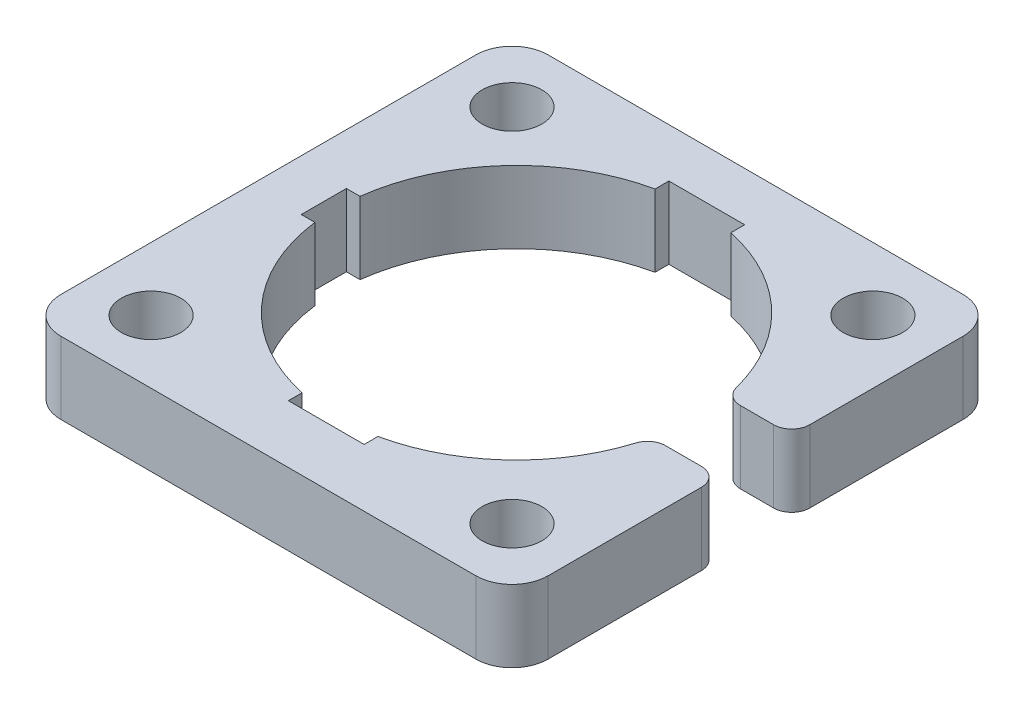
ISO-10303-21;
HEADER;
FILE_DESCRIPTION(('STEP AP214'),'2;1');
FILE_NAME('part.step','',(''),(''),'','','');
FILE_SCHEMA(('AUTOMOTIVE_DESIGN { 1 0 10303 214 1 1 1 1 }'));
ENDSEC;
DATA;
#1=APPLICATION_CONTEXT('core data for automotive mechanical design processes');
#2=APPLICATION_PROTOCOL_DEFINITION('international standard','automotive_design',2000,#1);
#3=PRODUCT_CONTEXT('',#1,'mechanical');
#4=PRODUCT('Part','Part','',(#3));
#5=PRODUCT_RELATED_PRODUCT_CATEGORY('part','',(#4));
#6=PRODUCT_DEFINITION_FORMATION('','',#4);
#7=PRODUCT_DEFINITION_CONTEXT('part definition',#1,'design');
#8=PRODUCT_DEFINITION('design','',#6,#7);
#9=PRODUCT_DEFINITION_SHAPE('','',#8);
#10=(LENGTH_UNIT() NAMED_UNIT(*) SI_UNIT(.MILLI.,.METRE.));
#11=(NAMED_UNIT(*) PLANE_ANGLE_UNIT() SI_UNIT($,.RADIAN.));
#12=(NAMED_UNIT(*) SI_UNIT($,.STERADIAN.) SOLID_ANGLE_UNIT());
#13=UNCERTAINTY_MEASURE_WITH_UNIT(LENGTH_MEASURE(1.E-05),#10,'distance_accuracy_value','');
#14=(GEOMETRIC_REPRESENTATION_CONTEXT(3) GLOBAL_UNCERTAINTY_ASSIGNED_CONTEXT((#13)) GLOBAL_UNIT_ASSIGNED_CONTEXT((#10,
#11,#12)) REPRESENTATION_CONTEXT('',''));
#15=CARTESIAN_POINT('',(0.,0.,0.));
#16=DIRECTION('',(0.,0.,1.));
#17=DIRECTION('',(1.,0.,0.));
#18=AXIS2_PLACEMENT_3D('',#15,#16,#17);
#19=CARTESIAN_POINT('',(13.5,4.,13.5));
#20=DIRECTION('',(-1.,0.,0.));
#21=DIRECTION('',(0.,0.,1.));
#22=AXIS2_PLACEMENT_3D('',#19,#20,#21);
#23=PLANE('',#22);
#24=DIRECTION('',(0.,0.,-1.));
#25=VECTOR('',#24,1.);
#26=CARTESIAN_POINT('',(13.5,0.,13.5));
#27=LINE('',#26,#25);
#28=CARTESIAN_POINT('',(13.5,0.,11.5));
#29=VERTEX_POINT('',#28);
#30=CARTESIAN_POINT('',(13.5,0.,3.));
#31=VERTEX_POINT('',#30);
#32=EDGE_CURVE('E379',#29,#31,#27,.T.);
#33=ORIENTED_EDGE('',*,*,#32,.T.);
#34=DIRECTION('',(0.,1.,0.));
#35=VECTOR('',#34,1.);
#36=CARTESIAN_POINT('',(13.5,4.,3.));
#37=LINE('',#36,#35);
#38=CARTESIAN_POINT('',(13.5,4.,3.));
#39=VERTEX_POINT('',#38);
#40=EDGE_CURVE('E428',#31,#39,#37,.T.);
#41=ORIENTED_EDGE('',*,*,#40,.T.);
#42=DIRECTION('',(0.,0.,-1.));
#43=VECTOR('',#42,1.);
#44=CARTESIAN_POINT('',(13.5,4.,13.5));
#45=LINE('',#44,#43);
#46=CARTESIAN_POINT('',(13.5,4.,11.5));
#47=VERTEX_POINT('',#46);
#48=EDGE_CURVE('E365',#47,#39,#45,.T.);
#49=ORIENTED_EDGE('',*,*,#48,.F.);
#50=DIRECTION('',(0.,-1.,0.));
#51=VECTOR('',#50,1.);
#52=CARTESIAN_POINT('',(13.5,4.,11.5));
#53=LINE('',#52,#51);
#54=EDGE_CURVE('E404',#47,#29,#53,.T.);
#55=ORIENTED_EDGE('',*,*,#54,.T.);
#56=EDGE_LOOP('',(#33,#41,#49,#55));
#57=FACE_BOUND('',#56,.T.);
#58=ADVANCED_FACE('F37',(#57),#23,.F.);
#59=CARTESIAN_POINT('',(0.,4.,0.));
#60=DIRECTION('',(0.,-1.,0.));
#61=DIRECTION('',(0.,0.,-1.));
#62=AXIS2_PLACEMENT_3D('',#59,#60,#61);
#63=PLANE('',#62);
#64=ORIENTED_EDGE('',*,*,#48,.T.);
#65=CARTESIAN_POINT('',(12.5,4.,3.));
#66=DIRECTION('',(0.,-1.,0.));
#67=DIRECTION('',(0.,0.,-1.));
#68=AXIS2_PLACEMENT_3D('',#65,#66,#67);
#69=CIRCLE('',#68,1.);
#70=CARTESIAN_POINT('',(12.5,4.,2.));
#71=VERTEX_POINT('',#70);
#72=EDGE_CURVE('E437',#39,#71,#69,.F.);
#73=ORIENTED_EDGE('',*,*,#72,.T.);
#74=DIRECTION('',(1.,0.,0.));
#75=VECTOR('',#74,1.);
#76=CARTESIAN_POINT('',(17.9420867867306,4.,2.));
#77=LINE('',#76,#75);
#78=CARTESIAN_POINT('',(10.5089247784919,4.,2.));
#79=VERTEX_POINT('',#78);
#80=EDGE_CURVE('E256',#79,#71,#77,.T.);
#81=ORIENTED_EDGE('',*,*,#80,.F.);
#82=CARTESIAN_POINT('',(10.5089247784919,4.,3.));
#83=DIRECTION('',(0.,-1.,0.));
#84=DIRECTION('',(0.,0.,-1.));
#85=AXIS2_PLACEMENT_3D('',#82,#83,#84);
#86=CIRCLE('',#85,1.);
#87=CARTESIAN_POINT('',(9.55356798044714,4.,2.70454545454545));
#88=VERTEX_POINT('',#87);
#89=EDGE_CURVE('E435',#79,#88,#86,.F.);
#90=ORIENTED_EDGE('',*,*,#89,.T.);
#91=CARTESIAN_POINT('',(0.,4.,-0.250000000000002));
#92=DIRECTION('',(0.,1.,0.));
#93=DIRECTION('',(0.,0.,1.));
#94=AXIS2_PLACEMENT_3D('',#91,#92,#93);
#95=CIRCLE('',#94,10.);
#96=CARTESIAN_POINT('',(2.1,4.,9.52701385904714));
#97=VERTEX_POINT('',#96);
#98=EDGE_CURVE('E296',#97,#88,#95,.T.);
#99=ORIENTED_EDGE('',*,*,#98,.F.);
#100=DIRECTION('',(0.,0.,-1.));
#101=VECTOR('',#100,1.);
#102=CARTESIAN_POINT('',(2.1,4.,10.2928885984819));
#103=LINE('',#102,#101);
#104=CARTESIAN_POINT('',(2.1,4.,10.2928885984819));
#105=VERTEX_POINT('',#104);
#106=EDGE_CURVE('E293',#105,#97,#103,.T.);
#107=ORIENTED_EDGE('',*,*,#106,.F.);
#108=DIRECTION('',(1.,0.,0.));
#109=VECTOR('',#108,1.);
#110=CARTESIAN_POINT('',(-2.1,4.,10.2928885984819));
#111=LINE('',#110,#109);
#112=CARTESIAN_POINT('',(-2.1,4.,10.2928885984819));
#113=VERTEX_POINT('',#112);
#114=EDGE_CURVE('E290',#113,#105,#111,.T.);
#115=ORIENTED_EDGE('',*,*,#114,.F.);
#116=DIRECTION('',(0.,0.,1.));
#117=VECTOR('',#116,1.);
#118=CARTESIAN_POINT('',(-2.1,4.,9.52701385904714));
#119=LINE('',#118,#117);
#120=CARTESIAN_POINT('',(-2.1,4.,9.52701385904714));
#121=VERTEX_POINT('',#120);
#122=EDGE_CURVE('E287',#121,#113,#119,.T.);
#123=ORIENTED_EDGE('',*,*,#122,.F.);
#124=CARTESIAN_POINT('',(0.,4.,-0.250000000000002));
#125=DIRECTION('',(0.,1.,0.));
#126=DIRECTION('',(0.,0.,1.));
#127=AXIS2_PLACEMENT_3D('',#124,#125,#126);
#128=CIRCLE('',#127,10.);
#129=CARTESIAN_POINT('',(-9.92156741649221,4.,1.));
#130=VERTEX_POINT('',#129);
#131=EDGE_CURVE('E231',#130,#121,#128,.T.);
#132=ORIENTED_EDGE('',*,*,#131,.F.);
#133=DIRECTION('',(1.,0.,0.));
#134=VECTOR('',#133,1.);
#135=CARTESIAN_POINT('',(-10.6770782520313,4.,0.999999999999998));
#136=LINE('',#135,#134);
#137=CARTESIAN_POINT('',(-10.6770782520313,4.,0.999999999999998));
#138=VERTEX_POINT('',#137);
#139=EDGE_CURVE('E250',#138,#130,#136,.T.);
#140=ORIENTED_EDGE('',*,*,#139,.F.);
#141=DIRECTION('',(0.,0.,1.));
#142=VECTOR('',#141,1.);
#143=CARTESIAN_POINT('',(-10.6770782520313,4.,-1.5));
#144=LINE('',#143,#142);
#145=CARTESIAN_POINT('',(-10.6770782520313,4.,-1.5));
#146=VERTEX_POINT('',#145);
#147=EDGE_CURVE('E253',#146,#138,#144,.T.);
#148=ORIENTED_EDGE('',*,*,#147,.F.);
#149=DIRECTION('',(-1.,0.,0.));
#150=VECTOR('',#149,1.);
#151=CARTESIAN_POINT('',(-9.92156741649221,4.,-1.5));
#152=LINE('',#151,#150);
#153=CARTESIAN_POINT('',(-9.92156741649221,4.,-1.5));
#154=VERTEX_POINT('',#153);
#155=EDGE_CURVE('E313',#154,#146,#152,.T.);
#156=ORIENTED_EDGE('',*,*,#155,.F.);
#157=CARTESIAN_POINT('',(0.,4.,-0.250000000000002));
#158=DIRECTION('',(0.,1.,0.));
#159=DIRECTION('',(0.,0.,1.));
#160=AXIS2_PLACEMENT_3D('',#157,#158,#159);
#161=CIRCLE('',#160,10.);
#162=CARTESIAN_POINT('',(-2.1,4.,-10.0270138590471));
#163=VERTEX_POINT('',#162);
#164=EDGE_CURVE('E310',#163,#154,#161,.T.);
#165=ORIENTED_EDGE('',*,*,#164,.F.);
#166=DIRECTION('',(0.,0.,1.));
#167=VECTOR('',#166,1.);
#168=CARTESIAN_POINT('',(-2.1,4.,-10.0270138590471));
#169=LINE('',#168,#167);
#170=CARTESIAN_POINT('',(-2.1,4.,-10.7928885984819));
#171=VERTEX_POINT('',#170);
#172=EDGE_CURVE('E307',#171,#163,#169,.T.);
#173=ORIENTED_EDGE('',*,*,#172,.F.);
#174=DIRECTION('',(-1.,0.,0.));
#175=VECTOR('',#174,1.);
#176=CARTESIAN_POINT('',(-2.1,4.,-10.7928885984819));
#177=LINE('',#176,#175);
#178=CARTESIAN_POINT('',(2.1,4.,-10.7928885984819));
#179=VERTEX_POINT('',#178);
#180=EDGE_CURVE('E304',#179,#171,#177,.T.);
#181=ORIENTED_EDGE('',*,*,#180,.F.);
#182=DIRECTION('',(0.,0.,-1.));
#183=VECTOR('',#182,1.);
#184=CARTESIAN_POINT('',(2.1,4.,-10.7928885984819));
#185=LINE('',#184,#183);
#186=CARTESIAN_POINT('',(2.1,4.,-10.0270138590472));
#187=VERTEX_POINT('',#186);
#188=EDGE_CURVE('E301',#187,#179,#185,.T.);
#189=ORIENTED_EDGE('',*,*,#188,.F.);
#190=CARTESIAN_POINT('',(0.,4.,-0.250000000000002));
#191=DIRECTION('',(0.,1.,0.));
#192=DIRECTION('',(0.,0.,1.));
#193=AXIS2_PLACEMENT_3D('',#190,#191,#192);
#194=CIRCLE('',#193,10.);
#195=CARTESIAN_POINT('',(9.68245836551854,4.,-2.75));
#196=VERTEX_POINT('',#195);
#197=EDGE_CURVE('E299',#196,#187,#194,.T.);
#198=ORIENTED_EDGE('',*,*,#197,.F.);
#199=CARTESIAN_POINT('',(10.6507042020704,4.,-3.));
#200=DIRECTION('',(0.,-1.,0.));
#201=DIRECTION('',(0.,0.,-1.));
#202=AXIS2_PLACEMENT_3D('',#199,#200,#201);
#203=CIRCLE('',#202,1.);
#204=CARTESIAN_POINT('',(10.6507042020704,4.,-2.));
#205=VERTEX_POINT('',#204);
#206=EDGE_CURVE('E433',#196,#205,#203,.F.);
#207=ORIENTED_EDGE('',*,*,#206,.T.);
#208=DIRECTION('',(-1.,0.,0.));
#209=VECTOR('',#208,1.);
#210=CARTESIAN_POINT('',(17.9420867867306,4.,-2.));
#211=LINE('',#210,#209);
#212=CARTESIAN_POINT('',(12.5,4.,-2.));
#213=VERTEX_POINT('',#212);
#214=EDGE_CURVE('E463',#213,#205,#211,.T.);
#215=ORIENTED_EDGE('',*,*,#214,.F.);
#216=CARTESIAN_POINT('',(12.5,4.,-3.));
#217=DIRECTION('',(0.,-1.,0.));
#218=DIRECTION('',(0.,0.,-1.));
#219=AXIS2_PLACEMENT_3D('',#216,#217,#218);
#220=CIRCLE('',#219,1.);
#221=CARTESIAN_POINT('',(13.5,4.,-3.));
#222=VERTEX_POINT('',#221);
#223=EDGE_CURVE('E431',#213,#222,#220,.F.);
#224=ORIENTED_EDGE('',*,*,#223,.T.);
#225=CARTESIAN_POINT('',(13.5,4.,-11.5));
#226=VERTEX_POINT('',#225);
#227=EDGE_CURVE('E369',#222,#226,#45,.T.);
#228=ORIENTED_EDGE('',*,*,#227,.T.);
#229=CARTESIAN_POINT('',(11.5,4.,-11.5));
#230=DIRECTION('',(0.,-1.,0.));
#231=DIRECTION('',(0.,0.,-1.));
#232=AXIS2_PLACEMENT_3D('',#229,#230,#231);
#233=CIRCLE('',#232,2.);
#234=CARTESIAN_POINT('',(11.5,4.,-13.5));
#235=VERTEX_POINT('',#234);
#236=EDGE_CURVE('E416',#226,#235,#233,.F.);
#237=ORIENTED_EDGE('',*,*,#236,.T.);
#238=DIRECTION('',(-1.,0.,0.));
#239=VECTOR('',#238,1.);
#240=CARTESIAN_POINT('',(-13.5,4.,-13.5));
#241=LINE('',#240,#239);
#242=CARTESIAN_POINT('',(-11.5,4.,-13.5));
#243=VERTEX_POINT('',#242);
#244=EDGE_CURVE('E368',#235,#243,#241,.T.);
#245=ORIENTED_EDGE('',*,*,#244,.T.);
#246=CARTESIAN_POINT('',(-11.5,4.,-11.5));
#247=DIRECTION('',(0.,-1.,0.));
#248=DIRECTION('',(0.,0.,-1.));
#249=AXIS2_PLACEMENT_3D('',#246,#247,#248);
#250=CIRCLE('',#249,2.);
#251=CARTESIAN_POINT('',(-13.5,4.,-11.5));
#252=VERTEX_POINT('',#251);
#253=EDGE_CURVE('E410',#243,#252,#250,.F.);
#254=ORIENTED_EDGE('',*,*,#253,.T.);
#255=DIRECTION('',(0.,0.,1.));
#256=VECTOR('',#255,1.);
#257=CARTESIAN_POINT('',(-13.5,4.,13.5));
#258=LINE('',#257,#256);
#259=CARTESIAN_POINT('',(-13.5,4.,11.5));
#260=VERTEX_POINT('',#259);
#261=EDGE_CURVE('E372',#252,#260,#258,.T.);
#262=ORIENTED_EDGE('',*,*,#261,.T.);
#263=CARTESIAN_POINT('',(-11.5,4.,11.5));
#264=DIRECTION('',(0.,-1.,0.));
#265=DIRECTION('',(0.,0.,-1.));
#266=AXIS2_PLACEMENT_3D('',#263,#264,#265);
#267=CIRCLE('',#266,2.);
#268=CARTESIAN_POINT('',(-11.5,4.,13.5));
#269=VERTEX_POINT('',#268);
#270=EDGE_CURVE('E412',#260,#269,#267,.F.);
#271=ORIENTED_EDGE('',*,*,#270,.T.);
#272=DIRECTION('',(1.,0.,0.));
#273=VECTOR('',#272,1.);
#274=CARTESIAN_POINT('',(-13.5,4.,13.5));
#275=LINE('',#274,#273);
#276=CARTESIAN_POINT('',(11.5,4.,13.5));
#277=VERTEX_POINT('',#276);
#278=EDGE_CURVE('E375',#269,#277,#275,.T.);
#279=ORIENTED_EDGE('',*,*,#278,.T.);
#280=CARTESIAN_POINT('',(11.5,4.,11.5));
#281=DIRECTION('',(0.,-1.,0.));
#282=DIRECTION('',(0.,0.,-1.));
#283=AXIS2_PLACEMENT_3D('',#280,#281,#282);
#284=CIRCLE('',#283,2.);
#285=EDGE_CURVE('E414',#277,#47,#284,.F.);
#286=ORIENTED_EDGE('',*,*,#285,.T.);
#287=EDGE_LOOP('',(#64,#73,#81,#90,#99,#107,#115,#123,#132,#140,#148,#156,#165,#173,#181,#189,
#198,#207,#215,#224,#228,#237,#245,#254,#262,#271,#279,#286));
#288=FACE_BOUND('',#287,.T.);
#289=CARTESIAN_POINT('',(10.,4.,-10.));
#290=DIRECTION('',(0.,1.,0.));
#291=DIRECTION('',(0.,0.,1.));
#292=AXIS2_PLACEMENT_3D('',#289,#290,#291);
#293=CIRCLE('',#292,1.64999999999999);
#294=CARTESIAN_POINT('',(10.,4.,-8.35000000000001));
#295=VERTEX_POINT('',#294);
#296=EDGE_CURVE('E359',#295,#295,#293,.T.);
#297=ORIENTED_EDGE('',*,*,#296,.F.);
#298=EDGE_LOOP('',(#297));
#299=FACE_BOUND('',#298,.T.);
#300=CARTESIAN_POINT('',(10.,4.,10.));
#301=DIRECTION('',(0.,1.,0.));
#302=DIRECTION('',(0.,0.,1.));
#303=AXIS2_PLACEMENT_3D('',#300,#301,#302);
#304=CIRCLE('',#303,1.64999999999999);
#305=CARTESIAN_POINT('',(10.,4.,11.65));
#306=VERTEX_POINT('',#305);
#307=EDGE_CURVE('E353',#306,#306,#304,.T.);
#308=ORIENTED_EDGE('',*,*,#307,.F.);
#309=EDGE_LOOP('',(#308));
#310=FACE_BOUND('',#309,.T.);
#311=CARTESIAN_POINT('',(-10.,4.,10.));
#312=DIRECTION('',(0.,1.,0.));
#313=DIRECTION('',(0.,0.,1.));
#314=AXIS2_PLACEMENT_3D('',#311,#312,#313);
#315=CIRCLE('',#314,1.65);
#316=CARTESIAN_POINT('',(-10.,4.,11.65));
#317=VERTEX_POINT('',#316);
#318=EDGE_CURVE('E347',#317,#317,#315,.T.);
#319=ORIENTED_EDGE('',*,*,#318,.F.);
#320=EDGE_LOOP('',(#319));
#321=FACE_BOUND('',#320,.T.);
#322=CARTESIAN_POINT('',(-10.,4.,-10.));
#323=DIRECTION('',(0.,1.,0.));
#324=DIRECTION('',(0.,0.,1.));
#325=AXIS2_PLACEMENT_3D('',#322,#323,#324);
#326=CIRCLE('',#325,1.65);
#327=CARTESIAN_POINT('',(-10.,4.,-8.35));
#328=VERTEX_POINT('',#327);
#329=EDGE_CURVE('E341',#328,#328,#326,.T.);
#330=ORIENTED_EDGE('',*,*,#329,.F.);
#331=EDGE_LOOP('',(#330));
#332=FACE_BOUND('',#331,.T.);
#333=ADVANCED_FACE('F475',(#288,#299,#310,#321,#332),#63,.F.);
#334=CARTESIAN_POINT('',(0.,0.,0.));
#335=DIRECTION('',(0.,-1.,0.));
#336=DIRECTION('',(0.,0.,-1.));
#337=AXIS2_PLACEMENT_3D('',#334,#335,#336);
#338=PLANE('',#337);
#339=DIRECTION('',(1.,0.,0.));
#340=VECTOR('',#339,1.);
#341=CARTESIAN_POINT('',(17.9420867867306,0.,2.));
#342=LINE('',#341,#340);
#343=CARTESIAN_POINT('',(10.5089247784919,0.,2.));
#344=VERTEX_POINT('',#343);
#345=CARTESIAN_POINT('',(12.5,0.,2.));
#346=VERTEX_POINT('',#345);
#347=EDGE_CURVE('E288',#344,#346,#342,.T.);
#348=ORIENTED_EDGE('',*,*,#347,.T.);
#349=CARTESIAN_POINT('',(12.5,0.,3.));
#350=DIRECTION('',(0.,-1.,0.));
#351=DIRECTION('',(0.,0.,-1.));
#352=AXIS2_PLACEMENT_3D('',#349,#350,#351);
#353=CIRCLE('',#352,1.);
#354=EDGE_CURVE('E447',#346,#31,#353,.T.);
#355=ORIENTED_EDGE('',*,*,#354,.T.);
#356=ORIENTED_EDGE('',*,*,#32,.F.);
#357=CARTESIAN_POINT('',(11.5,0.,11.5));
#358=DIRECTION('',(0.,-1.,0.));
#359=DIRECTION('',(0.,0.,-1.));
#360=AXIS2_PLACEMENT_3D('',#357,#358,#359);
#361=CIRCLE('',#360,2.);
#362=CARTESIAN_POINT('',(11.5,0.,13.5));
#363=VERTEX_POINT('',#362);
#364=EDGE_CURVE('E399',#29,#363,#361,.T.);
#365=ORIENTED_EDGE('',*,*,#364,.T.);
#366=DIRECTION('',(1.,0.,0.));
#367=VECTOR('',#366,1.);
#368=CARTESIAN_POINT('',(-13.5,0.,13.5));
#369=LINE('',#368,#367);
#370=CARTESIAN_POINT('',(-11.5,0.,13.5));
#371=VERTEX_POINT('',#370);
#372=EDGE_CURVE('E388',#371,#363,#369,.T.);
#373=ORIENTED_EDGE('',*,*,#372,.F.);
#374=CARTESIAN_POINT('',(-11.5,0.,11.5));
#375=DIRECTION('',(0.,-1.,0.));
#376=DIRECTION('',(0.,0.,-1.));
#377=AXIS2_PLACEMENT_3D('',#374,#375,#376);
#378=CIRCLE('',#377,2.);
#379=CARTESIAN_POINT('',(-13.5,0.,11.5));
#380=VERTEX_POINT('',#379);
#381=EDGE_CURVE('E397',#371,#380,#378,.T.);
#382=ORIENTED_EDGE('',*,*,#381,.T.);
#383=DIRECTION('',(0.,0.,1.));
#384=VECTOR('',#383,1.);
#385=CARTESIAN_POINT('',(-13.5,0.,13.5));
#386=LINE('',#385,#384);
#387=CARTESIAN_POINT('',(-13.5,0.,-11.5));
#388=VERTEX_POINT('',#387);
#389=EDGE_CURVE('E385',#388,#380,#386,.T.);
#390=ORIENTED_EDGE('',*,*,#389,.F.);
#391=CARTESIAN_POINT('',(-11.5,0.,-11.5));
#392=DIRECTION('',(0.,-1.,0.));
#393=DIRECTION('',(0.,0.,-1.));
#394=AXIS2_PLACEMENT_3D('',#391,#392,#393);
#395=CIRCLE('',#394,2.);
#396=CARTESIAN_POINT('',(-11.5,0.,-13.5));
#397=VERTEX_POINT('',#396);
#398=EDGE_CURVE('E395',#388,#397,#395,.T.);
#399=ORIENTED_EDGE('',*,*,#398,.T.);
#400=DIRECTION('',(-1.,0.,0.));
#401=VECTOR('',#400,1.);
#402=CARTESIAN_POINT('',(-13.5,0.,-13.5));
#403=LINE('',#402,#401);
#404=CARTESIAN_POINT('',(11.5,0.,-13.5));
#405=VERTEX_POINT('',#404);
#406=EDGE_CURVE('E382',#405,#397,#403,.T.);
#407=ORIENTED_EDGE('',*,*,#406,.F.);
#408=CARTESIAN_POINT('',(11.5,0.,-11.5));
#409=DIRECTION('',(0.,-1.,0.));
#410=DIRECTION('',(0.,0.,-1.));
#411=AXIS2_PLACEMENT_3D('',#408,#409,#410);
#412=CIRCLE('',#411,2.);
#413=CARTESIAN_POINT('',(13.5,0.,-11.5));
#414=VERTEX_POINT('',#413);
#415=EDGE_CURVE('E401',#405,#414,#412,.T.);
#416=ORIENTED_EDGE('',*,*,#415,.T.);
#417=CARTESIAN_POINT('',(13.5,0.,-3.));
#418=VERTEX_POINT('',#417);
#419=EDGE_CURVE('E362',#418,#414,#27,.T.);
#420=ORIENTED_EDGE('',*,*,#419,.F.);
#421=CARTESIAN_POINT('',(12.5,0.,-3.));
#422=DIRECTION('',(0.,-1.,0.));
#423=DIRECTION('',(0.,0.,-1.));
#424=AXIS2_PLACEMENT_3D('',#421,#422,#423);
#425=CIRCLE('',#424,1.);
#426=CARTESIAN_POINT('',(12.5,0.,-2.));
#427=VERTEX_POINT('',#426);
#428=EDGE_CURVE('E443',#418,#427,#425,.T.);
#429=ORIENTED_EDGE('',*,*,#428,.T.);
#430=DIRECTION('',(-1.,0.,0.));
#431=VECTOR('',#430,1.);
#432=CARTESIAN_POINT('',(17.9420867867306,0.,-2.));
#433=LINE('',#432,#431);
#434=CARTESIAN_POINT('',(10.6507042020704,0.,-2.));
#435=VERTEX_POINT('',#434);
#436=EDGE_CURVE('E460',#427,#435,#433,.T.);
#437=ORIENTED_EDGE('',*,*,#436,.T.);
#438=CARTESIAN_POINT('',(10.6507042020704,0.,-3.));
#439=DIRECTION('',(0.,-1.,0.));
#440=DIRECTION('',(0.,0.,-1.));
#441=AXIS2_PLACEMENT_3D('',#438,#439,#440);
#442=CIRCLE('',#441,1.);
#443=CARTESIAN_POINT('',(9.68245836551854,0.,-2.75));
#444=VERTEX_POINT('',#443);
#445=EDGE_CURVE('E60',#435,#444,#442,.T.);
#446=ORIENTED_EDGE('',*,*,#445,.T.);
#447=CARTESIAN_POINT('',(0.,0.,-0.250000000000002));
#448=DIRECTION('',(0.,1.,0.));
#449=DIRECTION('',(0.,0.,1.));
#450=AXIS2_PLACEMENT_3D('',#447,#448,#449);
#451=CIRCLE('',#450,10.);
#452=CARTESIAN_POINT('',(2.1,0.,-10.0270138590472));
#453=VERTEX_POINT('',#452);
#454=EDGE_CURVE('E266',#444,#453,#451,.T.);
#455=ORIENTED_EDGE('',*,*,#454,.T.);
#456=DIRECTION('',(0.,0.,-1.));
#457=VECTOR('',#456,1.);
#458=CARTESIAN_POINT('',(2.1,0.,-10.7928885984819));
#459=LINE('',#458,#457);
#460=CARTESIAN_POINT('',(2.1,0.,-10.7928885984819));
#461=VERTEX_POINT('',#460);
#462=EDGE_CURVE('E268',#453,#461,#459,.T.);
#463=ORIENTED_EDGE('',*,*,#462,.T.);
#464=DIRECTION('',(-1.,0.,0.));
#465=VECTOR('',#464,1.);
#466=CARTESIAN_POINT('',(-2.1,0.,-10.7928885984819));
#467=LINE('',#466,#465);
#468=CARTESIAN_POINT('',(-2.1,0.,-10.7928885984819));
#469=VERTEX_POINT('',#468);
#470=EDGE_CURVE('E271',#461,#469,#467,.T.);
#471=ORIENTED_EDGE('',*,*,#470,.T.);
#472=DIRECTION('',(0.,0.,1.));
#473=VECTOR('',#472,1.);
#474=CARTESIAN_POINT('',(-2.1,0.,-10.0270138590471));
#475=LINE('',#474,#473);
#476=CARTESIAN_POINT('',(-2.1,0.,-10.0270138590471));
#477=VERTEX_POINT('',#476);
#478=EDGE_CURVE('E274',#469,#477,#475,.T.);
#479=ORIENTED_EDGE('',*,*,#478,.T.);
#480=CARTESIAN_POINT('',(0.,0.,-0.250000000000002));
#481=DIRECTION('',(0.,1.,0.));
#482=DIRECTION('',(0.,0.,1.));
#483=AXIS2_PLACEMENT_3D('',#480,#481,#482);
#484=CIRCLE('',#483,10.);
#485=CARTESIAN_POINT('',(-9.92156741649221,0.,-1.5));
#486=VERTEX_POINT('',#485);
#487=EDGE_CURVE('E277',#477,#486,#484,.T.);
#488=ORIENTED_EDGE('',*,*,#487,.T.);
#489=DIRECTION('',(-1.,0.,0.));
#490=VECTOR('',#489,1.);
#491=CARTESIAN_POINT('',(-9.92156741649221,0.,-1.5));
#492=LINE('',#491,#490);
#493=CARTESIAN_POINT('',(-10.6770782520313,0.,-1.5));
#494=VERTEX_POINT('',#493);
#495=EDGE_CURVE('E280',#486,#494,#492,.T.);
#496=ORIENTED_EDGE('',*,*,#495,.T.);
#497=DIRECTION('',(0.,0.,1.));
#498=VECTOR('',#497,1.);
#499=CARTESIAN_POINT('',(-10.6770782520313,0.,-1.5));
#500=LINE('',#499,#498);
#501=CARTESIAN_POINT('',(-10.6770782520313,0.,0.999999999999998));
#502=VERTEX_POINT('',#501);
#503=EDGE_CURVE('E283',#494,#502,#500,.T.);
#504=ORIENTED_EDGE('',*,*,#503,.T.);
#505=DIRECTION('',(1.,0.,0.));
#506=VECTOR('',#505,1.);
#507=CARTESIAN_POINT('',(-10.6770782520313,0.,0.999999999999998));
#508=LINE('',#507,#506);
#509=CARTESIAN_POINT('',(-9.92156741649221,0.,1.));
#510=VERTEX_POINT('',#509);
#511=EDGE_CURVE('E236',#502,#510,#508,.T.);
#512=ORIENTED_EDGE('',*,*,#511,.T.);
#513=CARTESIAN_POINT('',(0.,0.,-0.250000000000002));
#514=DIRECTION('',(0.,1.,0.));
#515=DIRECTION('',(0.,0.,1.));
#516=AXIS2_PLACEMENT_3D('',#513,#514,#515);
#517=CIRCLE('',#516,10.);
#518=CARTESIAN_POINT('',(-2.1,0.,9.52701385904714));
#519=VERTEX_POINT('',#518);
#520=EDGE_CURVE('E228',#510,#519,#517,.T.);
#521=ORIENTED_EDGE('',*,*,#520,.T.);
#522=DIRECTION('',(0.,0.,1.));
#523=VECTOR('',#522,1.);
#524=CARTESIAN_POINT('',(-2.1,0.,9.52701385904714));
#525=LINE('',#524,#523);
#526=CARTESIAN_POINT('',(-2.1,0.,10.2928885984819));
#527=VERTEX_POINT('',#526);
#528=EDGE_CURVE('E240',#519,#527,#525,.T.);
#529=ORIENTED_EDGE('',*,*,#528,.T.);
#530=DIRECTION('',(1.,0.,0.));
#531=VECTOR('',#530,1.);
#532=CARTESIAN_POINT('',(-2.1,0.,10.2928885984819));
#533=LINE('',#532,#531);
#534=CARTESIAN_POINT('',(2.1,0.,10.2928885984819));
#535=VERTEX_POINT('',#534);
#536=EDGE_CURVE('E243',#527,#535,#533,.T.);
#537=ORIENTED_EDGE('',*,*,#536,.T.);
#538=DIRECTION('',(0.,0.,-1.));
#539=VECTOR('',#538,1.);
#540=CARTESIAN_POINT('',(2.1,0.,10.2928885984819));
#541=LINE('',#540,#539);
#542=CARTESIAN_POINT('',(2.1,0.,9.52701385904714));
#543=VERTEX_POINT('',#542);
#544=EDGE_CURVE('E260',#535,#543,#541,.T.);
#545=ORIENTED_EDGE('',*,*,#544,.T.);
#546=CARTESIAN_POINT('',(0.,0.,-0.250000000000002));
#547=DIRECTION('',(0.,1.,0.));
#548=DIRECTION('',(0.,0.,1.));
#549=AXIS2_PLACEMENT_3D('',#546,#547,#548);
#550=CIRCLE('',#549,10.);
#551=CARTESIAN_POINT('',(9.55356798044714,0.,2.70454545454545));
#552=VERTEX_POINT('',#551);
#553=EDGE_CURVE('E263',#543,#552,#550,.T.);
#554=ORIENTED_EDGE('',*,*,#553,.T.);
#555=CARTESIAN_POINT('',(10.5089247784919,0.,3.));
#556=DIRECTION('',(0.,-1.,0.));
#557=DIRECTION('',(0.,0.,-1.));
#558=AXIS2_PLACEMENT_3D('',#555,#556,#557);
#559=CIRCLE('',#558,1.);
#560=EDGE_CURVE('E52',#552,#344,#559,.T.);
#561=ORIENTED_EDGE('',*,*,#560,.T.);
#562=EDGE_LOOP('',(#348,#355,#356,#365,#373,#382,#390,#399,#407,#416,#420,#429,#437,#446,#455,
#463,#471,#479,#488,#496,#504,#512,#521,#529,#537,#545,#554,#561));
#563=FACE_BOUND('',#562,.T.);
#564=CARTESIAN_POINT('',(-10.,0.,10.));
#565=DIRECTION('',(0.,1.,0.));
#566=DIRECTION('',(0.,0.,1.));
#567=AXIS2_PLACEMENT_3D('',#564,#565,#566);
#568=CIRCLE('',#567,1.65);
#569=CARTESIAN_POINT('',(-10.,0.,11.65));
#570=VERTEX_POINT('',#569);
#571=EDGE_CURVE('E344',#570,#570,#568,.T.);
#572=ORIENTED_EDGE('',*,*,#571,.T.);
#573=EDGE_LOOP('',(#572));
#574=FACE_BOUND('',#573,.T.);
#575=CARTESIAN_POINT('',(10.,0.,-10.));
#576=DIRECTION('',(0.,1.,0.));
#577=DIRECTION('',(0.,0.,1.));
#578=AXIS2_PLACEMENT_3D('',#575,#576,#577);
#579=CIRCLE('',#578,1.64999999999999);
#580=CARTESIAN_POINT('',(10.,0.,-8.35000000000001));
#581=VERTEX_POINT('',#580);
#582=EDGE_CURVE('E356',#581,#581,#579,.T.);
#583=ORIENTED_EDGE('',*,*,#582,.T.);
#584=EDGE_LOOP('',(#583));
#585=FACE_BOUND('',#584,.T.);
#586=CARTESIAN_POINT('',(10.,0.,10.));
#587=DIRECTION('',(0.,1.,0.));
#588=DIRECTION('',(0.,0.,1.));
#589=AXIS2_PLACEMENT_3D('',#586,#587,#588);
#590=CIRCLE('',#589,1.64999999999999);
#591=CARTESIAN_POINT('',(10.,0.,11.65));
#592=VERTEX_POINT('',#591);
#593=EDGE_CURVE('E350',#592,#592,#590,.T.);
#594=ORIENTED_EDGE('',*,*,#593,.T.);
#595=EDGE_LOOP('',(#594));
#596=FACE_BOUND('',#595,.T.);
#597=CARTESIAN_POINT('',(-10.,0.,-10.));
#598=DIRECTION('',(0.,1.,0.));
#599=DIRECTION('',(0.,0.,1.));
#600=AXIS2_PLACEMENT_3D('',#597,#598,#599);
#601=CIRCLE('',#600,1.65);
#602=CARTESIAN_POINT('',(-10.,0.,-8.35));
#603=VERTEX_POINT('',#602);
#604=EDGE_CURVE('E320',#603,#603,#601,.T.);
#605=ORIENTED_EDGE('',*,*,#604,.T.);
#606=EDGE_LOOP('',(#605));
#607=FACE_BOUND('',#606,.T.);
#608=ADVANCED_FACE('F246',(#563,#574,#585,#596,#607),#338,.T.);
#609=ORIENTED_EDGE('',*,*,#227,.F.);
#610=DIRECTION('',(0.,-1.,0.));
#611=VECTOR('',#610,1.);
#612=CARTESIAN_POINT('',(13.5,4.,-3.));
#613=LINE('',#612,#611);
#614=EDGE_CURVE('E11',#222,#418,#613,.T.);
#615=ORIENTED_EDGE('',*,*,#614,.T.);
#616=ORIENTED_EDGE('',*,*,#419,.T.);
#617=DIRECTION('',(0.,-1.,0.));
#618=VECTOR('',#617,1.);
#619=CARTESIAN_POINT('',(13.5,4.,-11.5));
#620=LINE('',#619,#618);
#621=EDGE_CURVE('E407',#414,#226,#620,.F.);
#622=ORIENTED_EDGE('',*,*,#621,.T.);
#623=EDGE_LOOP('',(#609,#615,#616,#622));
#624=FACE_BOUND('',#623,.T.);
#625=ADVANCED_FACE('F563',(#624),#23,.F.);
#626=CARTESIAN_POINT('',(-13.5,4.,-13.5));
#627=DIRECTION('',(0.,0.,1.));
#628=DIRECTION('',(1.,0.,0.));
#629=AXIS2_PLACEMENT_3D('',#626,#627,#628);
#630=PLANE('',#629);
#631=ORIENTED_EDGE('',*,*,#244,.F.);
#632=DIRECTION('',(0.,-1.,0.));
#633=VECTOR('',#632,1.);
#634=CARTESIAN_POINT('',(11.5,4.,-13.5));
#635=LINE('',#634,#633);
#636=EDGE_CURVE('E392',#235,#405,#635,.T.);
#637=ORIENTED_EDGE('',*,*,#636,.T.);
#638=ORIENTED_EDGE('',*,*,#406,.T.);
#639=DIRECTION('',(0.,-1.,0.));
#640=VECTOR('',#639,1.);
#641=CARTESIAN_POINT('',(-11.5,4.,-13.5));
#642=LINE('',#641,#640);
#643=EDGE_CURVE('E378',#397,#243,#642,.F.);
#644=ORIENTED_EDGE('',*,*,#643,.T.);
#645=EDGE_LOOP('',(#631,#637,#638,#644));
#646=FACE_BOUND('',#645,.T.);
#647=ADVANCED_FACE('F555',(#646),#630,.F.);
#648=CARTESIAN_POINT('',(-13.5,4.,13.5));
#649=DIRECTION('',(1.,0.,0.));
#650=DIRECTION('',(0.,0.,-1.));
#651=AXIS2_PLACEMENT_3D('',#648,#649,#650);
#652=PLANE('',#651);
#653=ORIENTED_EDGE('',*,*,#389,.T.);
#654=DIRECTION('',(0.,-1.,0.));
#655=VECTOR('',#654,1.);
#656=CARTESIAN_POINT('',(-13.5,4.,11.5));
#657=LINE('',#656,#655);
#658=EDGE_CURVE('E426',#380,#260,#657,.F.);
#659=ORIENTED_EDGE('',*,*,#658,.T.);
#660=ORIENTED_EDGE('',*,*,#261,.F.);
#661=DIRECTION('',(0.,-1.,0.));
#662=VECTOR('',#661,1.);
#663=CARTESIAN_POINT('',(-13.5,4.,-11.5));
#664=LINE('',#663,#662);
#665=EDGE_CURVE('E423',#252,#388,#664,.T.);
#666=ORIENTED_EDGE('',*,*,#665,.T.);
#667=EDGE_LOOP('',(#653,#659,#660,#666));
#668=FACE_BOUND('',#667,.T.);
#669=ADVANCED_FACE('F545',(#668),#652,.F.);
#670=CARTESIAN_POINT('',(-13.5,4.,13.5));
#671=DIRECTION('',(0.,0.,-1.));
#672=DIRECTION('',(-1.,0.,0.));
#673=AXIS2_PLACEMENT_3D('',#670,#671,#672);
#674=PLANE('',#673);
#675=ORIENTED_EDGE('',*,*,#372,.T.);
#676=DIRECTION('',(0.,-1.,0.));
#677=VECTOR('',#676,1.);
#678=CARTESIAN_POINT('',(11.5,4.,13.5));
#679=LINE('',#678,#677);
#680=EDGE_CURVE('E421',#363,#277,#679,.F.);
#681=ORIENTED_EDGE('',*,*,#680,.T.);
#682=ORIENTED_EDGE('',*,*,#278,.F.);
#683=DIRECTION('',(0.,-1.,0.));
#684=VECTOR('',#683,1.);
#685=CARTESIAN_POINT('',(-11.5,4.,13.5));
#686=LINE('',#685,#684);
#687=EDGE_CURVE('E418',#269,#371,#686,.T.);
#688=ORIENTED_EDGE('',*,*,#687,.T.);
#689=EDGE_LOOP('',(#675,#681,#682,#688));
#690=FACE_BOUND('',#689,.T.);
#691=ADVANCED_FACE('F537',(#690),#674,.F.);
#692=CARTESIAN_POINT('',(10.,4.,-10.));
#693=DIRECTION('',(0.,-1.,0.));
#694=DIRECTION('',(0.,0.,-1.));
#695=AXIS2_PLACEMENT_3D('',#692,#693,#694);
#696=CYLINDRICAL_SURFACE('',#695,1.64999999999999);
#697=ORIENTED_EDGE('',*,*,#296,.T.);
#698=EDGE_LOOP('',(#697));
#699=FACE_BOUND('',#698,.T.);
#700=ORIENTED_EDGE('',*,*,#582,.F.);
#701=EDGE_LOOP('',(#700));
#702=FACE_BOUND('',#701,.T.);
#703=ADVANCED_FACE('F591',(#699,#702),#696,.F.);
#704=CARTESIAN_POINT('',(10.,4.,10.));
#705=DIRECTION('',(0.,-1.,0.));
#706=DIRECTION('',(0.,0.,-1.));
#707=AXIS2_PLACEMENT_3D('',#704,#705,#706);
#708=CYLINDRICAL_SURFACE('',#707,1.64999999999999);
#709=ORIENTED_EDGE('',*,*,#307,.T.);
#710=EDGE_LOOP('',(#709));
#711=FACE_BOUND('',#710,.T.);
#712=ORIENTED_EDGE('',*,*,#593,.F.);
#713=EDGE_LOOP('',(#712));
#714=FACE_BOUND('',#713,.T.);
#715=ADVANCED_FACE('F608',(#711,#714),#708,.F.);
#716=CARTESIAN_POINT('',(-10.,4.,10.));
#717=DIRECTION('',(0.,-1.,0.));
#718=DIRECTION('',(0.,0.,-1.));
#719=AXIS2_PLACEMENT_3D('',#716,#717,#718);
#720=CYLINDRICAL_SURFACE('',#719,1.65);
#721=ORIENTED_EDGE('',*,*,#318,.T.);
#722=EDGE_LOOP('',(#721));
#723=FACE_BOUND('',#722,.T.);
#724=ORIENTED_EDGE('',*,*,#571,.F.);
#725=EDGE_LOOP('',(#724));
#726=FACE_BOUND('',#725,.T.);
#727=ADVANCED_FACE('F615',(#723,#726),#720,.F.);
#728=CARTESIAN_POINT('',(-10.,4.,-10.));
#729=DIRECTION('',(0.,-1.,0.));
#730=DIRECTION('',(0.,0.,-1.));
#731=AXIS2_PLACEMENT_3D('',#728,#729,#730);
#732=CYLINDRICAL_SURFACE('',#731,1.65);
#733=ORIENTED_EDGE('',*,*,#329,.T.);
#734=EDGE_LOOP('',(#733));
#735=FACE_BOUND('',#734,.T.);
#736=ORIENTED_EDGE('',*,*,#604,.F.);
#737=EDGE_LOOP('',(#736));
#738=FACE_BOUND('',#737,.T.);
#739=ADVANCED_FACE('F623',(#735,#738),#732,.F.);
#740=CARTESIAN_POINT('',(0.,0.,-0.250000000000002));
#741=DIRECTION('',(0.,1.,0.));
#742=DIRECTION('',(0.,0.,1.));
#743=AXIS2_PLACEMENT_3D('',#740,#741,#742);
#744=CYLINDRICAL_SURFACE('',#743,10.);
#745=ORIENTED_EDGE('',*,*,#131,.T.);
#746=DIRECTION('',(0.,1.,0.));
#747=VECTOR('',#746,1.);
#748=CARTESIAN_POINT('',(-2.1,0.,9.52701385904714));
#749=LINE('',#748,#747);
#750=EDGE_CURVE('E224',#519,#121,#749,.T.);
#751=ORIENTED_EDGE('',*,*,#750,.F.);
#752=ORIENTED_EDGE('',*,*,#520,.F.);
#753=DIRECTION('',(0.,1.,0.));
#754=VECTOR('',#753,1.);
#755=CARTESIAN_POINT('',(-9.92156741649221,0.,1.));
#756=LINE('',#755,#754);
#757=EDGE_CURVE('E318',#510,#130,#756,.T.);
#758=ORIENTED_EDGE('',*,*,#757,.T.);
#759=EDGE_LOOP('',(#745,#751,#752,#758));
#760=FACE_BOUND('',#759,.T.);
#761=ADVANCED_FACE('F226',(#760),#744,.F.);
#762=CARTESIAN_POINT('',(-10.6770782520313,0.,0.999999999999998));
#763=DIRECTION('',(0.,0.,1.));
#764=DIRECTION('',(1.,0.,0.));
#765=AXIS2_PLACEMENT_3D('',#762,#763,#764);
#766=PLANE('',#765);
#767=ORIENTED_EDGE('',*,*,#139,.T.);
#768=ORIENTED_EDGE('',*,*,#757,.F.);
#769=ORIENTED_EDGE('',*,*,#511,.F.);
#770=DIRECTION('',(0.,1.,0.));
#771=VECTOR('',#770,1.);
#772=CARTESIAN_POINT('',(-10.6770782520313,0.,0.999999999999998));
#773=LINE('',#772,#771);
#774=EDGE_CURVE('E321',#502,#138,#773,.T.);
#775=ORIENTED_EDGE('',*,*,#774,.T.);
#776=EDGE_LOOP('',(#767,#768,#769,#775));
#777=FACE_BOUND('',#776,.T.);
#778=ADVANCED_FACE('F502',(#777),#766,.F.);
#779=CARTESIAN_POINT('',(-10.6770782520313,0.,-1.5));
#780=DIRECTION('',(-1.,0.,0.));
#781=DIRECTION('',(0.,0.,1.));
#782=AXIS2_PLACEMENT_3D('',#779,#780,#781);
#783=PLANE('',#782);
#784=ORIENTED_EDGE('',*,*,#147,.T.);
#785=ORIENTED_EDGE('',*,*,#774,.F.);
#786=ORIENTED_EDGE('',*,*,#503,.F.);
#787=DIRECTION('',(0.,1.,0.));
#788=VECTOR('',#787,1.);
#789=CARTESIAN_POINT('',(-10.6770782520313,0.,-1.5));
#790=LINE('',#789,#788);
#791=EDGE_CURVE('E323',#494,#146,#790,.T.);
#792=ORIENTED_EDGE('',*,*,#791,.T.);
#793=EDGE_LOOP('',(#784,#785,#786,#792));
#794=FACE_BOUND('',#793,.T.);
#795=ADVANCED_FACE('F499',(#794),#783,.F.);
#796=CARTESIAN_POINT('',(-9.92156741649221,0.,-1.5));
#797=DIRECTION('',(0.,0.,-1.));
#798=DIRECTION('',(-1.,0.,0.));
#799=AXIS2_PLACEMENT_3D('',#796,#797,#798);
#800=PLANE('',#799);
#801=ORIENTED_EDGE('',*,*,#155,.T.);
#802=ORIENTED_EDGE('',*,*,#791,.F.);
#803=ORIENTED_EDGE('',*,*,#495,.F.);
#804=DIRECTION('',(0.,1.,0.));
#805=VECTOR('',#804,1.);
#806=CARTESIAN_POINT('',(-9.92156741649221,0.,-1.5));
#807=LINE('',#806,#805);
#808=EDGE_CURVE('E325',#486,#154,#807,.T.);
#809=ORIENTED_EDGE('',*,*,#808,.T.);
#810=EDGE_LOOP('',(#801,#802,#803,#809));
#811=FACE_BOUND('',#810,.T.);
#812=ADVANCED_FACE('F495',(#811),#800,.F.);
#813=CARTESIAN_POINT('',(0.,0.,-0.250000000000002));
#814=DIRECTION('',(0.,1.,0.));
#815=DIRECTION('',(0.,0.,1.));
#816=AXIS2_PLACEMENT_3D('',#813,#814,#815);
#817=CYLINDRICAL_SURFACE('',#816,10.);
#818=ORIENTED_EDGE('',*,*,#164,.T.);
#819=ORIENTED_EDGE('',*,*,#808,.F.);
#820=ORIENTED_EDGE('',*,*,#487,.F.);
#821=DIRECTION('',(0.,1.,0.));
#822=VECTOR('',#821,1.);
#823=CARTESIAN_POINT('',(-2.1,0.,-10.0270138590471));
#824=LINE('',#823,#822);
#825=EDGE_CURVE('E327',#477,#163,#824,.T.);
#826=ORIENTED_EDGE('',*,*,#825,.T.);
#827=EDGE_LOOP('',(#818,#819,#820,#826));
#828=FACE_BOUND('',#827,.T.);
#829=ADVANCED_FACE('F491',(#828),#817,.F.);
#830=CARTESIAN_POINT('',(-2.1,0.,-10.0270138590471));
#831=DIRECTION('',(-1.,0.,0.));
#832=DIRECTION('',(0.,0.,1.));
#833=AXIS2_PLACEMENT_3D('',#830,#831,#832);
#834=PLANE('',#833);
#835=ORIENTED_EDGE('',*,*,#172,.T.);
#836=ORIENTED_EDGE('',*,*,#825,.F.);
#837=ORIENTED_EDGE('',*,*,#478,.F.);
#838=DIRECTION('',(0.,1.,0.));
#839=VECTOR('',#838,1.);
#840=CARTESIAN_POINT('',(-2.1,0.,-10.7928885984819));
#841=LINE('',#840,#839);
#842=EDGE_CURVE('E329',#469,#171,#841,.T.);
#843=ORIENTED_EDGE('',*,*,#842,.T.);
#844=EDGE_LOOP('',(#835,#836,#837,#843));
#845=FACE_BOUND('',#844,.T.);
#846=ADVANCED_FACE('F487',(#845),#834,.F.);
#847=CARTESIAN_POINT('',(-2.1,0.,-10.7928885984819));
#848=DIRECTION('',(0.,0.,-1.));
#849=DIRECTION('',(-1.,0.,0.));
#850=AXIS2_PLACEMENT_3D('',#847,#848,#849);
#851=PLANE('',#850);
#852=ORIENTED_EDGE('',*,*,#180,.T.);
#853=ORIENTED_EDGE('',*,*,#842,.F.);
#854=ORIENTED_EDGE('',*,*,#470,.F.);
#855=DIRECTION('',(0.,1.,0.));
#856=VECTOR('',#855,1.);
#857=CARTESIAN_POINT('',(2.1,0.,-10.7928885984819));
#858=LINE('',#857,#856);
#859=EDGE_CURVE('E331',#461,#179,#858,.T.);
#860=ORIENTED_EDGE('',*,*,#859,.T.);
#861=EDGE_LOOP('',(#852,#853,#854,#860));
#862=FACE_BOUND('',#861,.T.);
#863=ADVANCED_FACE('F485',(#862),#851,.F.);
#864=CARTESIAN_POINT('',(2.1,0.,-10.7928885984819));
#865=DIRECTION('',(1.,0.,0.));
#866=DIRECTION('',(0.,0.,-1.));
#867=AXIS2_PLACEMENT_3D('',#864,#865,#866);
#868=PLANE('',#867);
#869=ORIENTED_EDGE('',*,*,#188,.T.);
#870=ORIENTED_EDGE('',*,*,#859,.F.);
#871=ORIENTED_EDGE('',*,*,#462,.F.);
#872=DIRECTION('',(0.,1.,0.));
#873=VECTOR('',#872,1.);
#874=CARTESIAN_POINT('',(2.1,0.,-10.0270138590472));
#875=LINE('',#874,#873);
#876=EDGE_CURVE('E333',#453,#187,#875,.T.);
#877=ORIENTED_EDGE('',*,*,#876,.T.);
#878=EDGE_LOOP('',(#869,#870,#871,#877));
#879=FACE_BOUND('',#878,.T.);
#880=ADVANCED_FACE('F480',(#879),#868,.F.);
#881=CARTESIAN_POINT('',(0.,0.,-0.250000000000002));
#882=DIRECTION('',(0.,1.,0.));
#883=DIRECTION('',(0.,0.,1.));
#884=AXIS2_PLACEMENT_3D('',#881,#882,#883);
#885=CYLINDRICAL_SURFACE('',#884,10.);
#886=ORIENTED_EDGE('',*,*,#454,.F.);
#887=DIRECTION('',(0.,1.,0.));
#888=VECTOR('',#887,1.);
#889=CARTESIAN_POINT('',(9.68245836551854,0.,-2.75));
#890=LINE('',#889,#888);
#891=EDGE_CURVE('E451',#444,#196,#890,.T.);
#892=ORIENTED_EDGE('',*,*,#891,.T.);
#893=ORIENTED_EDGE('',*,*,#197,.T.);
#894=ORIENTED_EDGE('',*,*,#876,.F.);
#895=EDGE_LOOP('',(#886,#892,#893,#894));
#896=FACE_BOUND('',#895,.T.);
#897=ADVANCED_FACE('F471',(#896),#885,.F.);
#898=CARTESIAN_POINT('',(0.,0.,-0.250000000000002));
#899=DIRECTION('',(0.,1.,0.));
#900=DIRECTION('',(0.,0.,1.));
#901=AXIS2_PLACEMENT_3D('',#898,#899,#900);
#902=CYLINDRICAL_SURFACE('',#901,10.);
#903=ORIENTED_EDGE('',*,*,#98,.T.);
#904=DIRECTION('',(0.,1.,0.));
#905=VECTOR('',#904,1.);
#906=CARTESIAN_POINT('',(9.55356798044714,0.,2.70454545454545));
#907=LINE('',#906,#905);
#908=EDGE_CURVE('E449',#88,#552,#907,.F.);
#909=ORIENTED_EDGE('',*,*,#908,.T.);
#910=ORIENTED_EDGE('',*,*,#553,.F.);
#911=DIRECTION('',(0.,1.,0.));
#912=VECTOR('',#911,1.);
#913=CARTESIAN_POINT('',(2.1,0.,9.52701385904714));
#914=LINE('',#913,#912);
#915=EDGE_CURVE('E336',#543,#97,#914,.T.);
#916=ORIENTED_EDGE('',*,*,#915,.T.);
#917=EDGE_LOOP('',(#903,#909,#910,#916));
#918=FACE_BOUND('',#917,.T.);
#919=ADVANCED_FACE('F513',(#918),#902,.F.);
#920=CARTESIAN_POINT('',(2.1,0.,10.2928885984819));
#921=DIRECTION('',(1.,0.,0.));
#922=DIRECTION('',(0.,0.,-1.));
#923=AXIS2_PLACEMENT_3D('',#920,#921,#922);
#924=PLANE('',#923);
#925=ORIENTED_EDGE('',*,*,#106,.T.);
#926=ORIENTED_EDGE('',*,*,#915,.F.);
#927=ORIENTED_EDGE('',*,*,#544,.F.);
#928=DIRECTION('',(0.,1.,0.));
#929=VECTOR('',#928,1.);
#930=CARTESIAN_POINT('',(2.1,0.,10.2928885984819));
#931=LINE('',#930,#929);
#932=EDGE_CURVE('E338',#535,#105,#931,.T.);
#933=ORIENTED_EDGE('',*,*,#932,.T.);
#934=EDGE_LOOP('',(#925,#926,#927,#933));
#935=FACE_BOUND('',#934,.T.);
#936=ADVANCED_FACE('F511',(#935),#924,.F.);
#937=CARTESIAN_POINT('',(-2.1,0.,10.2928885984819));
#938=DIRECTION('',(0.,0.,1.));
#939=DIRECTION('',(1.,0.,0.));
#940=AXIS2_PLACEMENT_3D('',#937,#938,#939);
#941=PLANE('',#940);
#942=ORIENTED_EDGE('',*,*,#114,.T.);
#943=ORIENTED_EDGE('',*,*,#932,.F.);
#944=ORIENTED_EDGE('',*,*,#536,.F.);
#945=DIRECTION('',(0.,1.,0.));
#946=VECTOR('',#945,1.);
#947=CARTESIAN_POINT('',(-2.1,0.,10.2928885984819));
#948=LINE('',#947,#946);
#949=EDGE_CURVE('E235',#527,#113,#948,.T.);
#950=ORIENTED_EDGE('',*,*,#949,.T.);
#951=EDGE_LOOP('',(#942,#943,#944,#950));
#952=FACE_BOUND('',#951,.T.);
#953=ADVANCED_FACE('F507',(#952),#941,.F.);
#954=CARTESIAN_POINT('',(-2.1,0.,9.52701385904714));
#955=DIRECTION('',(-1.,0.,0.));
#956=DIRECTION('',(0.,0.,1.));
#957=AXIS2_PLACEMENT_3D('',#954,#955,#956);
#958=PLANE('',#957);
#959=ORIENTED_EDGE('',*,*,#122,.T.);
#960=ORIENTED_EDGE('',*,*,#949,.F.);
#961=ORIENTED_EDGE('',*,*,#528,.F.);
#962=ORIENTED_EDGE('',*,*,#750,.T.);
#963=EDGE_LOOP('',(#959,#960,#961,#962));
#964=FACE_BOUND('',#963,.T.);
#965=ADVANCED_FACE('F241',(#964),#958,.F.);
#966=CARTESIAN_POINT('',(11.5,4.,-11.5));
#967=DIRECTION('',(0.,-1.,0.));
#968=DIRECTION('',(0.,0.,-1.));
#969=AXIS2_PLACEMENT_3D('',#966,#967,#968);
#970=CYLINDRICAL_SURFACE('',#969,2.);
#971=ORIENTED_EDGE('',*,*,#236,.F.);
#972=ORIENTED_EDGE('',*,*,#621,.F.);
#973=ORIENTED_EDGE('',*,*,#415,.F.);
#974=ORIENTED_EDGE('',*,*,#636,.F.);
#975=EDGE_LOOP('',(#971,#972,#973,#974));
#976=FACE_BOUND('',#975,.T.);
#977=ADVANCED_FACE('F559',(#976),#970,.T.);
#978=CARTESIAN_POINT('',(11.5,4.,11.5));
#979=DIRECTION('',(0.,-1.,0.));
#980=DIRECTION('',(0.,0.,-1.));
#981=AXIS2_PLACEMENT_3D('',#978,#979,#980);
#982=CYLINDRICAL_SURFACE('',#981,2.);
#983=ORIENTED_EDGE('',*,*,#285,.F.);
#984=ORIENTED_EDGE('',*,*,#680,.F.);
#985=ORIENTED_EDGE('',*,*,#364,.F.);
#986=ORIENTED_EDGE('',*,*,#54,.F.);
#987=EDGE_LOOP('',(#983,#984,#985,#986));
#988=FACE_BOUND('',#987,.T.);
#989=ADVANCED_FACE('F534',(#988),#982,.T.);
#990=CARTESIAN_POINT('',(-11.5,4.,11.5));
#991=DIRECTION('',(0.,-1.,0.));
#992=DIRECTION('',(0.,0.,-1.));
#993=AXIS2_PLACEMENT_3D('',#990,#991,#992);
#994=CYLINDRICAL_SURFACE('',#993,2.);
#995=ORIENTED_EDGE('',*,*,#270,.F.);
#996=ORIENTED_EDGE('',*,*,#658,.F.);
#997=ORIENTED_EDGE('',*,*,#381,.F.);
#998=ORIENTED_EDGE('',*,*,#687,.F.);
#999=EDGE_LOOP('',(#995,#996,#997,#998));
#1000=FACE_BOUND('',#999,.T.);
#1001=ADVANCED_FACE('F541',(#1000),#994,.T.);
#1002=CARTESIAN_POINT('',(-11.5,4.,-11.5));
#1003=DIRECTION('',(0.,-1.,0.));
#1004=DIRECTION('',(0.,0.,-1.));
#1005=AXIS2_PLACEMENT_3D('',#1002,#1003,#1004);
#1006=CYLINDRICAL_SURFACE('',#1005,2.);
#1007=ORIENTED_EDGE('',*,*,#253,.F.);
#1008=ORIENTED_EDGE('',*,*,#643,.F.);
#1009=ORIENTED_EDGE('',*,*,#398,.F.);
#1010=ORIENTED_EDGE('',*,*,#665,.F.);
#1011=EDGE_LOOP('',(#1007,#1008,#1009,#1010));
#1012=FACE_BOUND('',#1011,.T.);
#1013=ADVANCED_FACE('F550',(#1012),#1006,.T.);
#1014=CARTESIAN_POINT('',(17.9420867867306,0.,2.));
#1015=DIRECTION('',(0.,0.,1.));
#1016=DIRECTION('',(1.,0.,0.));
#1017=AXIS2_PLACEMENT_3D('',#1014,#1015,#1016);
#1018=PLANE('',#1017);
#1019=ORIENTED_EDGE('',*,*,#80,.T.);
#1020=DIRECTION('',(0.,1.,0.));
#1021=VECTOR('',#1020,1.);
#1022=CARTESIAN_POINT('',(12.5,0.,2.));
#1023=LINE('',#1022,#1021);
#1024=EDGE_CURVE('E441',#71,#346,#1023,.F.);
#1025=ORIENTED_EDGE('',*,*,#1024,.T.);
#1026=ORIENTED_EDGE('',*,*,#347,.F.);
#1027=DIRECTION('',(0.,1.,0.));
#1028=VECTOR('',#1027,1.);
#1029=CARTESIAN_POINT('',(10.5089247784919,0.,2.));
#1030=LINE('',#1029,#1028);
#1031=EDGE_CURVE('E439',#344,#79,#1030,.T.);
#1032=ORIENTED_EDGE('',*,*,#1031,.T.);
#1033=EDGE_LOOP('',(#1019,#1025,#1026,#1032));
#1034=FACE_BOUND('',#1033,.T.);
#1035=ADVANCED_FACE('F733',(#1034),#1018,.F.);
#1036=CARTESIAN_POINT('',(17.9420867867306,0.,-2.));
#1037=DIRECTION('',(0.,0.,-1.));
#1038=DIRECTION('',(-1.,0.,0.));
#1039=AXIS2_PLACEMENT_3D('',#1036,#1037,#1038);
#1040=PLANE('',#1039);
#1041=ORIENTED_EDGE('',*,*,#214,.T.);
#1042=DIRECTION('',(0.,1.,0.));
#1043=VECTOR('',#1042,1.);
#1044=CARTESIAN_POINT('',(10.6507042020704,0.,-2.));
#1045=LINE('',#1044,#1043);
#1046=EDGE_CURVE('E45',#205,#435,#1045,.F.);
#1047=ORIENTED_EDGE('',*,*,#1046,.T.);
#1048=ORIENTED_EDGE('',*,*,#436,.F.);
#1049=DIRECTION('',(0.,-1.,0.));
#1050=VECTOR('',#1049,1.);
#1051=CARTESIAN_POINT('',(12.5,0.,-2.));
#1052=LINE('',#1051,#1050);
#1053=EDGE_CURVE('E454',#427,#213,#1052,.F.);
#1054=ORIENTED_EDGE('',*,*,#1053,.T.);
#1055=EDGE_LOOP('',(#1041,#1047,#1048,#1054));
#1056=FACE_BOUND('',#1055,.T.);
#1057=ADVANCED_FACE('F459',(#1056),#1040,.F.);
#1058=CARTESIAN_POINT('',(12.5,4.,3.));
#1059=DIRECTION('',(0.,1.,0.));
#1060=DIRECTION('',(0.,0.,1.));
#1061=AXIS2_PLACEMENT_3D('',#1058,#1059,#1060);
#1062=CYLINDRICAL_SURFACE('',#1061,1.);
#1063=ORIENTED_EDGE('',*,*,#354,.F.);
#1064=ORIENTED_EDGE('',*,*,#1024,.F.);
#1065=ORIENTED_EDGE('',*,*,#72,.F.);
#1066=ORIENTED_EDGE('',*,*,#40,.F.);
#1067=EDGE_LOOP('',(#1063,#1064,#1065,#1066));
#1068=FACE_BOUND('',#1067,.T.);
#1069=ADVANCED_FACE('F526',(#1068),#1062,.T.);
#1070=CARTESIAN_POINT('',(10.5089247784919,0.,3.));
#1071=DIRECTION('',(0.,1.,0.));
#1072=DIRECTION('',(0.,0.,1.));
#1073=AXIS2_PLACEMENT_3D('',#1070,#1071,#1072);
#1074=CYLINDRICAL_SURFACE('',#1073,1.);
#1075=ORIENTED_EDGE('',*,*,#89,.F.);
#1076=ORIENTED_EDGE('',*,*,#1031,.F.);
#1077=ORIENTED_EDGE('',*,*,#560,.F.);
#1078=ORIENTED_EDGE('',*,*,#908,.F.);
#1079=EDGE_LOOP('',(#1075,#1076,#1077,#1078));
#1080=FACE_BOUND('',#1079,.T.);
#1081=ADVANCED_FACE('F515',(#1080),#1074,.T.);
#1082=CARTESIAN_POINT('',(10.6507042020704,0.,-3.));
#1083=DIRECTION('',(0.,1.,0.));
#1084=DIRECTION('',(0.,0.,1.));
#1085=AXIS2_PLACEMENT_3D('',#1082,#1083,#1084);
#1086=CYLINDRICAL_SURFACE('',#1085,1.);
#1087=ORIENTED_EDGE('',*,*,#445,.F.);
#1088=ORIENTED_EDGE('',*,*,#1046,.F.);
#1089=ORIENTED_EDGE('',*,*,#206,.F.);
#1090=ORIENTED_EDGE('',*,*,#891,.F.);
#1091=EDGE_LOOP('',(#1087,#1088,#1089,#1090));
#1092=FACE_BOUND('',#1091,.T.);
#1093=ADVANCED_FACE('F468',(#1092),#1086,.T.);
#1094=CARTESIAN_POINT('',(12.5,4.,-3.));
#1095=DIRECTION('',(0.,-1.,0.));
#1096=DIRECTION('',(0.,0.,-1.));
#1097=AXIS2_PLACEMENT_3D('',#1094,#1095,#1096);
#1098=CYLINDRICAL_SURFACE('',#1097,1.);
#1099=ORIENTED_EDGE('',*,*,#223,.F.);
#1100=ORIENTED_EDGE('',*,*,#1053,.F.);
#1101=ORIENTED_EDGE('',*,*,#428,.F.);
#1102=ORIENTED_EDGE('',*,*,#614,.F.);
#1103=EDGE_LOOP('',(#1099,#1100,#1101,#1102));
#1104=FACE_BOUND('',#1103,.T.);
#1105=ADVANCED_FACE('F39',(#1104),#1098,.T.);
#1106=CLOSED_SHELL('',(#58,#333,#608,#625,#647,#669,#691,#703,#715,#727,#739,#761,#778,#795,
#812,#829,#846,#863,#880,#897,#919,#936,#953,#965,#977,#989,#1001,#1013,#1035,#1057,#1069,#1081,
#1093,#1105));
#1107=MANIFOLD_SOLID_BREP('B2',#1106);
#1108=ADVANCED_BREP_SHAPE_REPRESENTATION('',(#18,#1107),#14);
#1109=SHAPE_DEFINITION_REPRESENTATION(#9,#1108);
ENDSEC;
END-ISO-10303-21;
